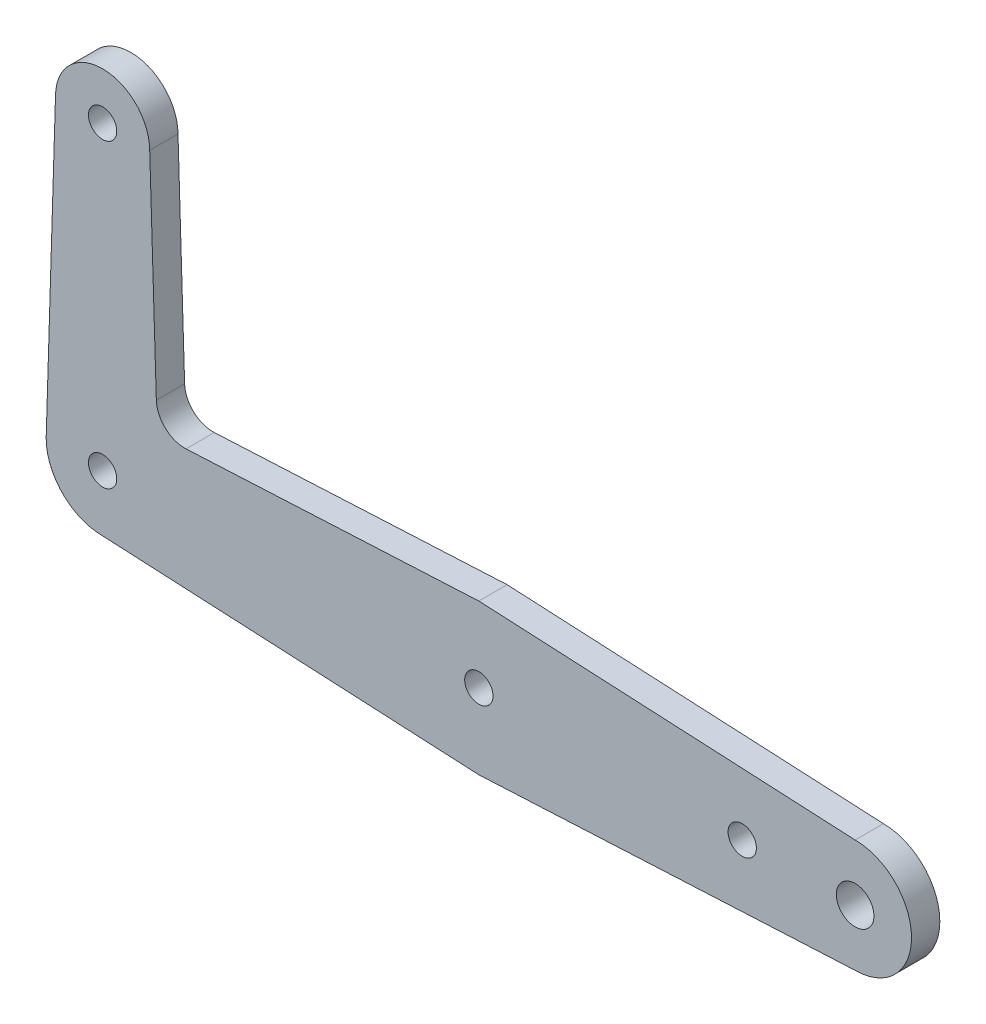
ISO-10303-21;
HEADER;
FILE_DESCRIPTION(('STEP AP214'),'2;1');
FILE_NAME('part.step','',(''),(''),'','','');
FILE_SCHEMA(('AUTOMOTIVE_DESIGN { 1 0 10303 214 1 1 1 1 }'));
ENDSEC;
DATA;
#1=APPLICATION_CONTEXT('core data for automotive mechanical design processes');
#2=APPLICATION_PROTOCOL_DEFINITION('international standard','automotive_design',2000,#1);
#3=PRODUCT_CONTEXT('',#1,'mechanical');
#4=PRODUCT('Part','Part','',(#3));
#5=PRODUCT_RELATED_PRODUCT_CATEGORY('part','',(#4));
#6=PRODUCT_DEFINITION_FORMATION('','',#4);
#7=PRODUCT_DEFINITION_CONTEXT('part definition',#1,'design');
#8=PRODUCT_DEFINITION('design','',#6,#7);
#9=PRODUCT_DEFINITION_SHAPE('','',#8);
#10=(LENGTH_UNIT() NAMED_UNIT(*) SI_UNIT(.MILLI.,.METRE.));
#11=(NAMED_UNIT(*) PLANE_ANGLE_UNIT() SI_UNIT($,.RADIAN.));
#12=(NAMED_UNIT(*) SI_UNIT($,.STERADIAN.) SOLID_ANGLE_UNIT());
#13=UNCERTAINTY_MEASURE_WITH_UNIT(LENGTH_MEASURE(1.E-05),#10,'distance_accuracy_value','');
#14=(GEOMETRIC_REPRESENTATION_CONTEXT(3) GLOBAL_UNCERTAINTY_ASSIGNED_CONTEXT((#13)) GLOBAL_UNIT_ASSIGNED_CONTEXT((#10,
#11,#12)) REPRESENTATION_CONTEXT('',''));
#15=CARTESIAN_POINT('',(0.,0.,0.));
#16=DIRECTION('',(0.,0.,1.));
#17=DIRECTION('',(1.,0.,0.));
#18=AXIS2_PLACEMENT_3D('',#15,#16,#17);
#19=CARTESIAN_POINT('',(3.32543640897757,-66.5087281795511,4.7752));
#20=DIRECTION('',(0.0499376169438924,-0.998752338877845,0.));
#21=DIRECTION('',(0.998752338877845,0.0499376169438924,0.));
#22=AXIS2_PLACEMENT_3D('',#19,#20,#21);
#23=PLANE('',#22);
#24=DIRECTION('',(-0.998752338877845,-0.0499376169438924,0.));
#25=VECTOR('',#24,1.);
#26=CARTESIAN_POINT('',(3.32543640897757,-66.5087281795511,0.));
#27=LINE('',#26,#25);
#28=CARTESIAN_POINT('',(127.,-60.325,0.));
#29=VERTEX_POINT('',#28);
#30=CARTESIAN_POINT('',(63.5,-63.5,0.));
#31=VERTEX_POINT('',#30);
#32=EDGE_CURVE('E196',#29,#31,#27,.T.);
#33=ORIENTED_EDGE('',*,*,#32,.F.);
#34=DIRECTION('',(0.,0.,-1.));
#35=VECTOR('',#34,1.);
#36=CARTESIAN_POINT('',(127.,-60.325,4.7752));
#37=LINE('',#36,#35);
#38=CARTESIAN_POINT('',(127.,-60.325,4.7752));
#39=VERTEX_POINT('',#38);
#40=EDGE_CURVE('E253',#39,#29,#37,.T.);
#41=ORIENTED_EDGE('',*,*,#40,.F.);
#42=DIRECTION('',(-0.998752338877845,-0.0499376169438924,0.));
#43=VECTOR('',#42,1.);
#44=CARTESIAN_POINT('',(3.32543640897757,-66.5087281795511,4.7752));
#45=LINE('',#44,#43);
#46=CARTESIAN_POINT('',(63.5,-63.5,4.7752));
#47=VERTEX_POINT('',#46);
#48=EDGE_CURVE('E153',#39,#47,#45,.T.);
#49=ORIENTED_EDGE('',*,*,#48,.T.);
#50=DIRECTION('',(0.,0.,-1.));
#51=VECTOR('',#50,1.);
#52=CARTESIAN_POINT('',(63.5,-63.5,4.7752));
#53=LINE('',#52,#51);
#54=EDGE_CURVE('E141',#47,#31,#53,.T.);
#55=ORIENTED_EDGE('',*,*,#54,.T.);
#56=EDGE_LOOP('',(#33,#41,#49,#55));
#57=FACE_BOUND('',#56,.T.);
#58=ADVANCED_FACE('F41',(#57),#23,.T.);
#59=CARTESIAN_POINT('',(127.,-50.8,4.7752));
#60=DIRECTION('',(0.,0.,-1.));
#61=DIRECTION('',(-1.,0.,0.));
#62=AXIS2_PLACEMENT_3D('',#59,#60,#61);
#63=CYLINDRICAL_SURFACE('',#62,9.52499999999999);
#64=CARTESIAN_POINT('',(127.,-50.8,0.));
#65=DIRECTION('',(0.,0.,1.));
#66=DIRECTION('',(1.,0.,0.));
#67=AXIS2_PLACEMENT_3D('',#64,#65,#66);
#68=CIRCLE('',#67,9.52499999999999);
#69=CARTESIAN_POINT('',(127.,-41.275,0.));
#70=VERTEX_POINT('',#69);
#71=EDGE_CURVE('E200',#29,#70,#68,.T.);
#72=ORIENTED_EDGE('',*,*,#71,.T.);
#73=DIRECTION('',(0.,0.,-1.));
#74=VECTOR('',#73,1.);
#75=CARTESIAN_POINT('',(127.,-41.275,4.7752));
#76=LINE('',#75,#74);
#77=CARTESIAN_POINT('',(127.,-41.275,4.7752));
#78=VERTEX_POINT('',#77);
#79=EDGE_CURVE('E249',#78,#70,#76,.T.);
#80=ORIENTED_EDGE('',*,*,#79,.F.);
#81=CARTESIAN_POINT('',(127.,-50.8,4.7752));
#82=DIRECTION('',(0.,0.,1.));
#83=DIRECTION('',(1.,0.,0.));
#84=AXIS2_PLACEMENT_3D('',#81,#82,#83);
#85=CIRCLE('',#84,9.52499999999999);
#86=EDGE_CURVE('E157',#39,#78,#85,.T.);
#87=ORIENTED_EDGE('',*,*,#86,.F.);
#88=ORIENTED_EDGE('',*,*,#40,.T.);
#89=EDGE_LOOP('',(#72,#80,#87,#88));
#90=FACE_BOUND('',#89,.T.);
#91=ADVANCED_FACE('F290',(#90),#63,.T.);
#92=CARTESIAN_POINT('',(-1.74189526184539,-34.8379052369077,4.7752));
#93=DIRECTION('',(-0.0499376169438924,-0.998752338877845,0.));
#94=DIRECTION('',(0.998752338877845,-0.0499376169438924,0.));
#95=AXIS2_PLACEMENT_3D('',#92,#93,#94);
#96=PLANE('',#95);
#97=DIRECTION('',(-0.998752338877845,0.0499376169438924,0.));
#98=VECTOR('',#97,1.);
#99=CARTESIAN_POINT('',(-1.74189526184539,-34.8379052369077,0.));
#100=LINE('',#99,#98);
#101=CARTESIAN_POINT('',(63.5,-38.1,0.));
#102=VERTEX_POINT('',#101);
#103=EDGE_CURVE('E204',#70,#102,#100,.T.);
#104=ORIENTED_EDGE('',*,*,#103,.T.);
#105=DIRECTION('',(0.,0.,-1.));
#106=VECTOR('',#105,1.);
#107=CARTESIAN_POINT('',(63.5,-38.1,4.7752));
#108=LINE('',#107,#106);
#109=CARTESIAN_POINT('',(63.5,-38.1,4.7752));
#110=VERTEX_POINT('',#109);
#111=EDGE_CURVE('E245',#110,#102,#108,.T.);
#112=ORIENTED_EDGE('',*,*,#111,.F.);
#113=DIRECTION('',(-0.998752338877845,0.0499376169438924,0.));
#114=VECTOR('',#113,1.);
#115=CARTESIAN_POINT('',(-1.74189526184539,-34.8379052369077,4.7752));
#116=LINE('',#115,#114);
#117=EDGE_CURVE('E164',#78,#110,#116,.T.);
#118=ORIENTED_EDGE('',*,*,#117,.F.);
#119=ORIENTED_EDGE('',*,*,#79,.T.);
#120=EDGE_LOOP('',(#104,#112,#118,#119));
#121=FACE_BOUND('',#120,.T.);
#122=ADVANCED_FACE('F296',(#121),#96,.F.);
#123=CARTESIAN_POINT('',(2.05860349127183,-41.1720698254364,4.7752));
#124=DIRECTION('',(0.0499376169438924,-0.998752338877845,0.));
#125=DIRECTION('',(0.998752338877845,0.0499376169438924,0.));
#126=AXIS2_PLACEMENT_3D('',#123,#124,#125);
#127=PLANE('',#126);
#128=DIRECTION('',(-0.998752338877845,-0.0499376169438924,0.));
#129=VECTOR('',#128,1.);
#130=CARTESIAN_POINT('',(2.05860349127183,-41.1720698254364,0.));
#131=LINE('',#130,#129);
#132=CARTESIAN_POINT('',(14.0760167079213,-40.5711991646039,0.));
#133=VERTEX_POINT('',#132);
#134=EDGE_CURVE('E208',#102,#133,#131,.T.);
#135=ORIENTED_EDGE('',*,*,#134,.T.);
#136=DIRECTION('',(0.,0.,-1.));
#137=VECTOR('',#136,1.);
#138=CARTESIAN_POINT('',(14.0760167079213,-40.5711991646039,4.7752));
#139=LINE('',#138,#137);
#140=CARTESIAN_POINT('',(14.0760167079213,-40.5711991646039,4.7752));
#141=VERTEX_POINT('',#140);
#142=EDGE_CURVE('E57',#133,#141,#139,.F.);
#143=ORIENTED_EDGE('',*,*,#142,.T.);
#144=DIRECTION('',(-0.998752338877845,-0.0499376169438924,0.));
#145=VECTOR('',#144,1.);
#146=CARTESIAN_POINT('',(2.05860349127183,-41.1720698254364,4.7752));
#147=LINE('',#146,#145);
#148=EDGE_CURVE('E168',#110,#141,#147,.T.);
#149=ORIENTED_EDGE('',*,*,#148,.F.);
#150=ORIENTED_EDGE('',*,*,#111,.T.);
#151=EDGE_LOOP('',(#135,#143,#149,#150));
#152=FACE_BOUND('',#151,.T.);
#153=ADVANCED_FACE('F323',(#152),#127,.F.);
#154=CARTESIAN_POINT('',(7.9425671929276,0.246219582980756,4.7752));
#155=DIRECTION('',(0.999519846043263,0.0309851152273412,0.));
#156=DIRECTION('',(-0.0309851152273412,0.999519846043263,0.));
#157=AXIS2_PLACEMENT_3D('',#154,#155,#156);
#158=PLANE('',#157);
#159=DIRECTION('',(0.0309851152273412,-0.999519846043263,0.));
#160=VECTOR('',#159,1.);
#161=CARTESIAN_POINT('',(7.9425671929276,0.246219582980756,4.7752));
#162=LINE('',#161,#160);
#163=CARTESIAN_POINT('',(7.9502,0.,4.7752));
#164=VERTEX_POINT('',#163);
#165=CARTESIAN_POINT('',(9.06464743066507,-35.9499171182281,4.7752));
#166=VERTEX_POINT('',#165);
#167=EDGE_CURVE('E171',#164,#166,#162,.T.);
#168=ORIENTED_EDGE('',*,*,#167,.T.);
#169=DIRECTION('',(0.,0.,-1.));
#170=VECTOR('',#169,1.);
#171=CARTESIAN_POINT('',(9.06464743066507,-35.9499171182281,4.7752));
#172=LINE('',#171,#170);
#173=CARTESIAN_POINT('',(9.06464743066507,-35.9499171182281,0.));
#174=VERTEX_POINT('',#173);
#175=EDGE_CURVE('E256',#166,#174,#172,.T.);
#176=ORIENTED_EDGE('',*,*,#175,.T.);
#177=DIRECTION('',(0.0309851152273412,-0.999519846043263,0.));
#178=VECTOR('',#177,1.);
#179=CARTESIAN_POINT('',(7.9425671929276,0.246219582980756,0.));
#180=LINE('',#179,#178);
#181=CARTESIAN_POINT('',(7.9502,0.,0.));
#182=VERTEX_POINT('',#181);
#183=EDGE_CURVE('E211',#182,#174,#180,.T.);
#184=ORIENTED_EDGE('',*,*,#183,.F.);
#185=DIRECTION('',(0.,0.,-1.));
#186=VECTOR('',#185,1.);
#187=CARTESIAN_POINT('',(7.9502,0.,4.7752));
#188=LINE('',#187,#186);
#189=EDGE_CURVE('E242',#164,#182,#188,.T.);
#190=ORIENTED_EDGE('',*,*,#189,.F.);
#191=EDGE_LOOP('',(#168,#176,#184,#190));
#192=FACE_BOUND('',#191,.T.);
#193=ADVANCED_FACE('F267',(#192),#158,.T.);
#194=CARTESIAN_POINT('',(0.,0.,4.7752));
#195=DIRECTION('',(0.,0.,-1.));
#196=DIRECTION('',(-1.,0.,0.));
#197=AXIS2_PLACEMENT_3D('',#194,#195,#196);
#198=CYLINDRICAL_SURFACE('',#197,7.9502);
#199=CARTESIAN_POINT('',(0.,0.,0.));
#200=DIRECTION('',(0.,0.,1.));
#201=DIRECTION('',(1.,0.,0.));
#202=AXIS2_PLACEMENT_3D('',#199,#200,#201);
#203=CIRCLE('',#202,7.9502);
#204=CARTESIAN_POINT('',(-7.9502,0.,0.));
#205=VERTEX_POINT('',#204);
#206=EDGE_CURVE('E214',#182,#205,#203,.T.);
#207=ORIENTED_EDGE('',*,*,#206,.T.);
#208=DIRECTION('',(0.,0.,-1.));
#209=VECTOR('',#208,1.);
#210=CARTESIAN_POINT('',(-7.9502,0.,4.7752));
#211=LINE('',#210,#209);
#212=CARTESIAN_POINT('',(-7.9502,0.,4.7752));
#213=VERTEX_POINT('',#212);
#214=EDGE_CURVE('E238',#213,#205,#211,.T.);
#215=ORIENTED_EDGE('',*,*,#214,.F.);
#216=CARTESIAN_POINT('',(0.,0.,4.7752));
#217=DIRECTION('',(0.,0.,1.));
#218=DIRECTION('',(1.,0.,0.));
#219=AXIS2_PLACEMENT_3D('',#216,#217,#218);
#220=CIRCLE('',#219,7.9502);
#221=EDGE_CURVE('E175',#164,#213,#220,.T.);
#222=ORIENTED_EDGE('',*,*,#221,.F.);
#223=ORIENTED_EDGE('',*,*,#189,.T.);
#224=EDGE_LOOP('',(#207,#215,#222,#223));
#225=FACE_BOUND('',#224,.T.);
#226=ADVANCED_FACE('F275',(#225),#198,.T.);
#227=CARTESIAN_POINT('',(-7.9425671929276,0.246219582980755,4.7752));
#228=DIRECTION('',(0.999519846043263,-0.0309851152273411,0.));
#229=DIRECTION('',(0.0309851152273411,0.999519846043263,0.));
#230=AXIS2_PLACEMENT_3D('',#227,#228,#229);
#231=PLANE('',#230);
#232=DIRECTION('',(-0.0309851152273411,-0.999519846043263,0.));
#233=VECTOR('',#232,1.);
#234=CARTESIAN_POINT('',(-7.9425671929276,0.246219582980755,0.));
#235=LINE('',#234,#233);
#236=CARTESIAN_POINT('',(-9.525,-50.8,0.));
#237=VERTEX_POINT('',#236);
#238=EDGE_CURVE('E218',#205,#237,#235,.T.);
#239=ORIENTED_EDGE('',*,*,#238,.T.);
#240=DIRECTION('',(0.,0.,-1.));
#241=VECTOR('',#240,1.);
#242=CARTESIAN_POINT('',(-9.525,-50.8,4.7752));
#243=LINE('',#242,#241);
#244=CARTESIAN_POINT('',(-9.525,-50.8,4.7752));
#245=VERTEX_POINT('',#244);
#246=EDGE_CURVE('E234',#245,#237,#243,.T.);
#247=ORIENTED_EDGE('',*,*,#246,.F.);
#248=DIRECTION('',(-0.0309851152273411,-0.999519846043263,0.));
#249=VECTOR('',#248,1.);
#250=CARTESIAN_POINT('',(-7.9425671929276,0.246219582980755,4.7752));
#251=LINE('',#250,#249);
#252=EDGE_CURVE('E179',#213,#245,#251,.T.);
#253=ORIENTED_EDGE('',*,*,#252,.F.);
#254=ORIENTED_EDGE('',*,*,#214,.T.);
#255=EDGE_LOOP('',(#239,#247,#253,#254));
#256=FACE_BOUND('',#255,.T.);
#257=ADVANCED_FACE('F309',(#256),#231,.F.);
#258=CARTESIAN_POINT('',(0.,-50.8,4.7752));
#259=DIRECTION('',(0.,0.,-1.));
#260=DIRECTION('',(-1.,0.,0.));
#261=AXIS2_PLACEMENT_3D('',#258,#259,#260);
#262=CYLINDRICAL_SURFACE('',#261,9.525);
#263=CARTESIAN_POINT('',(0.,-50.8,0.));
#264=DIRECTION('',(0.,0.,1.));
#265=DIRECTION('',(1.,0.,0.));
#266=AXIS2_PLACEMENT_3D('',#263,#264,#265);
#267=CIRCLE('',#266,9.525);
#268=CARTESIAN_POINT('',(0.,-60.325,0.));
#269=VERTEX_POINT('',#268);
#270=EDGE_CURVE('E222',#237,#269,#267,.T.);
#271=ORIENTED_EDGE('',*,*,#270,.T.);
#272=DIRECTION('',(0.,0.,-1.));
#273=VECTOR('',#272,1.);
#274=CARTESIAN_POINT('',(0.,-60.325,4.7752));
#275=LINE('',#274,#273);
#276=CARTESIAN_POINT('',(0.,-60.325,4.7752));
#277=VERTEX_POINT('',#276);
#278=EDGE_CURVE('E231',#277,#269,#275,.T.);
#279=ORIENTED_EDGE('',*,*,#278,.F.);
#280=CARTESIAN_POINT('',(0.,-50.8,4.7752));
#281=DIRECTION('',(0.,0.,1.));
#282=DIRECTION('',(1.,0.,0.));
#283=AXIS2_PLACEMENT_3D('',#280,#281,#282);
#284=CIRCLE('',#283,9.525);
#285=EDGE_CURVE('E183',#245,#277,#284,.T.);
#286=ORIENTED_EDGE('',*,*,#285,.F.);
#287=ORIENTED_EDGE('',*,*,#246,.T.);
#288=EDGE_LOOP('',(#271,#279,#286,#287));
#289=FACE_BOUND('',#288,.T.);
#290=ADVANCED_FACE('F305',(#289),#262,.T.);
#291=CARTESIAN_POINT('',(0.,-50.8,4.7752));
#292=DIRECTION('',(0.,0.,-1.));
#293=DIRECTION('',(-1.,0.,0.));
#294=AXIS2_PLACEMENT_3D('',#291,#292,#293);
#295=CYLINDRICAL_SURFACE('',#294,9.525);
#296=CARTESIAN_POINT('',(0.,-50.8,0.));
#297=DIRECTION('',(0.,0.,1.));
#298=DIRECTION('',(1.,0.,0.));
#299=AXIS2_PLACEMENT_3D('',#296,#297,#298);
#300=CIRCLE('',#299,9.525);
#301=CARTESIAN_POINT('',(9.525,-50.8,0.));
#302=VERTEX_POINT('',#301);
#303=CARTESIAN_POINT('',(9.50671052618434,-50.2100169736883,0.));
#304=VERTEX_POINT('',#303);
#305=EDGE_CURVE('E135',#302,#304,#300,.T.);
#306=ORIENTED_EDGE('',*,*,#305,.F.);
#307=DIRECTION('',(0.,0.,-1.));
#308=VECTOR('',#307,1.);
#309=CARTESIAN_POINT('',(9.525,-50.8,4.7752));
#310=LINE('',#309,#308);
#311=CARTESIAN_POINT('',(9.525,-50.8,4.7752));
#312=VERTEX_POINT('',#311);
#313=EDGE_CURVE('E129',#312,#302,#310,.T.);
#314=ORIENTED_EDGE('',*,*,#313,.F.);
#315=CARTESIAN_POINT('',(0.,-50.8,4.7752));
#316=DIRECTION('',(0.,0.,1.));
#317=DIRECTION('',(1.,0.,0.));
#318=AXIS2_PLACEMENT_3D('',#315,#316,#317);
#319=CIRCLE('',#318,9.525);
#320=CARTESIAN_POINT('',(9.50671052618434,-50.2100169736883,4.7752));
#321=VERTEX_POINT('',#320);
#322=EDGE_CURVE('E132',#312,#321,#319,.T.);
#323=ORIENTED_EDGE('',*,*,#322,.T.);
#324=DIRECTION('',(0.,0.,-1.));
#325=VECTOR('',#324,1.);
#326=CARTESIAN_POINT('',(9.50671052618434,-50.2100169736883,4.7752));
#327=LINE('',#326,#325);
#328=EDGE_CURVE('E142',#321,#304,#327,.T.);
#329=ORIENTED_EDGE('',*,*,#328,.T.);
#330=EDGE_LOOP('',(#306,#314,#323,#329));
#331=FACE_BOUND('',#330,.T.);
#332=ADVANCED_FACE('F131',(#331),#295,.F.);
#333=CARTESIAN_POINT('',(7.94256719292769,0.246219582980743,4.7752));
#334=DIRECTION('',(0.999519846043263,0.0309851152273392,0.));
#335=DIRECTION('',(-0.0309851152273392,0.999519846043263,0.));
#336=AXIS2_PLACEMENT_3D('',#333,#334,#335);
#337=PLANE('',#336);
#338=DIRECTION('',(0.0309851152273392,-0.999519846043263,0.));
#339=VECTOR('',#338,1.);
#340=CARTESIAN_POINT('',(7.94256719292769,0.246219582980743,0.));
#341=LINE('',#340,#339);
#342=EDGE_CURVE('E192',#304,#302,#341,.T.);
#343=ORIENTED_EDGE('',*,*,#342,.F.);
#344=ORIENTED_EDGE('',*,*,#328,.F.);
#345=DIRECTION('',(0.0309851152273392,-0.999519846043263,0.));
#346=VECTOR('',#345,1.);
#347=CARTESIAN_POINT('',(7.94256719292769,0.246219582980743,4.7752));
#348=LINE('',#347,#346);
#349=EDGE_CURVE('E147',#321,#312,#348,.T.);
#350=ORIENTED_EDGE('',*,*,#349,.T.);
#351=ORIENTED_EDGE('',*,*,#313,.T.);
#352=EDGE_LOOP('',(#343,#344,#350,#351));
#353=FACE_BOUND('',#352,.T.);
#354=ADVANCED_FACE('F151',(#353),#337,.T.);
#355=CARTESIAN_POINT('',(-3.00872817955113,-60.1745635910224,4.7752));
#356=DIRECTION('',(-0.0499376169438923,-0.998752338877845,0.));
#357=DIRECTION('',(0.998752338877845,-0.0499376169438923,0.));
#358=AXIS2_PLACEMENT_3D('',#355,#356,#357);
#359=PLANE('',#358);
#360=DIRECTION('',(-0.998752338877845,0.0499376169438923,0.));
#361=VECTOR('',#360,1.);
#362=CARTESIAN_POINT('',(-3.00872817955113,-60.1745635910224,0.));
#363=LINE('',#362,#361);
#364=EDGE_CURVE('E149',#31,#269,#363,.T.);
#365=ORIENTED_EDGE('',*,*,#364,.F.);
#366=ORIENTED_EDGE('',*,*,#54,.F.);
#367=DIRECTION('',(-0.998752338877845,0.0499376169438923,0.));
#368=VECTOR('',#367,1.);
#369=CARTESIAN_POINT('',(-3.00872817955113,-60.1745635910224,4.7752));
#370=LINE('',#369,#368);
#371=EDGE_CURVE('E186',#47,#277,#370,.T.);
#372=ORIENTED_EDGE('',*,*,#371,.T.);
#373=ORIENTED_EDGE('',*,*,#278,.T.);
#374=EDGE_LOOP('',(#365,#366,#372,#373));
#375=FACE_BOUND('',#374,.T.);
#376=ADVANCED_FACE('F303',(#375),#359,.T.);
#377=CARTESIAN_POINT('',(0.,0.,4.7752));
#378=DIRECTION('',(0.,0.,1.));
#379=DIRECTION('',(1.,0.,0.));
#380=AXIS2_PLACEMENT_3D('',#377,#378,#379);
#381=PLANE('',#380);
#382=CARTESIAN_POINT('',(127.,-50.8,4.7752));
#383=DIRECTION('',(0.,0.,1.));
#384=DIRECTION('',(1.,0.,0.));
#385=AXIS2_PLACEMENT_3D('',#382,#383,#384);
#386=CIRCLE('',#385,3.175);
#387=CARTESIAN_POINT('',(130.175,-50.8,4.7752));
#388=VERTEX_POINT('',#387);
#389=EDGE_CURVE('E370',#388,#388,#386,.T.);
#390=ORIENTED_EDGE('',*,*,#389,.F.);
#391=EDGE_LOOP('',(#390));
#392=FACE_BOUND('',#391,.T.);
#393=CARTESIAN_POINT('',(0.,0.,4.7752));
#394=DIRECTION('',(0.,0.,1.));
#395=DIRECTION('',(1.,0.,0.));
#396=AXIS2_PLACEMENT_3D('',#393,#394,#395);
#397=CIRCLE('',#396,2.3876);
#398=CARTESIAN_POINT('',(2.3876,0.,4.7752));
#399=VERTEX_POINT('',#398);
#400=EDGE_CURVE('E380',#399,#399,#397,.T.);
#401=ORIENTED_EDGE('',*,*,#400,.F.);
#402=EDGE_LOOP('',(#401));
#403=FACE_BOUND('',#402,.T.);
#404=CARTESIAN_POINT('',(0.,-50.8,4.7752));
#405=DIRECTION('',(0.,0.,1.));
#406=DIRECTION('',(1.,0.,0.));
#407=AXIS2_PLACEMENT_3D('',#404,#405,#406);
#408=CIRCLE('',#407,2.3876);
#409=CARTESIAN_POINT('',(2.3876,-50.8,4.7752));
#410=VERTEX_POINT('',#409);
#411=EDGE_CURVE('E388',#410,#410,#408,.T.);
#412=ORIENTED_EDGE('',*,*,#411,.F.);
#413=EDGE_LOOP('',(#412));
#414=FACE_BOUND('',#413,.T.);
#415=CARTESIAN_POINT('',(63.5,-50.8,4.7752));
#416=DIRECTION('',(0.,0.,1.));
#417=DIRECTION('',(1.,0.,0.));
#418=AXIS2_PLACEMENT_3D('',#415,#416,#417);
#419=CIRCLE('',#418,2.3876);
#420=CARTESIAN_POINT('',(65.8876,-50.8,4.7752));
#421=VERTEX_POINT('',#420);
#422=EDGE_CURVE('E396',#421,#421,#419,.T.);
#423=ORIENTED_EDGE('',*,*,#422,.F.);
#424=EDGE_LOOP('',(#423));
#425=FACE_BOUND('',#424,.T.);
#426=CARTESIAN_POINT('',(107.95,-50.8,4.7752));
#427=DIRECTION('',(0.,0.,1.));
#428=DIRECTION('',(1.,0.,0.));
#429=AXIS2_PLACEMENT_3D('',#426,#427,#428);
#430=CIRCLE('',#429,2.3876);
#431=CARTESIAN_POINT('',(110.3376,-50.8,4.7752));
#432=VERTEX_POINT('',#431);
#433=EDGE_CURVE('E374',#432,#432,#430,.T.);
#434=ORIENTED_EDGE('',*,*,#433,.F.);
#435=EDGE_LOOP('',(#434));
#436=FACE_BOUND('',#435,.T.);
#437=ORIENTED_EDGE('',*,*,#322,.F.);
#438=ORIENTED_EDGE('',*,*,#349,.F.);
#439=EDGE_LOOP('',(#437,#438));
#440=FACE_BOUND('',#439,.T.);
#441=ORIENTED_EDGE('',*,*,#48,.F.);
#442=ORIENTED_EDGE('',*,*,#86,.T.);
#443=ORIENTED_EDGE('',*,*,#117,.T.);
#444=ORIENTED_EDGE('',*,*,#148,.T.);
#445=CARTESIAN_POINT('',(13.8375545994909,-35.8019569959945,4.7752));
#446=DIRECTION('',(0.,0.,1.));
#447=DIRECTION('',(1.,0.,0.));
#448=AXIS2_PLACEMENT_3D('',#445,#446,#447);
#449=CIRCLE('',#448,4.7752);
#450=EDGE_CURVE('E11',#141,#166,#449,.F.);
#451=ORIENTED_EDGE('',*,*,#450,.T.);
#452=ORIENTED_EDGE('',*,*,#167,.F.);
#453=ORIENTED_EDGE('',*,*,#221,.T.);
#454=ORIENTED_EDGE('',*,*,#252,.T.);
#455=ORIENTED_EDGE('',*,*,#285,.T.);
#456=ORIENTED_EDGE('',*,*,#371,.F.);
#457=EDGE_LOOP('',(#441,#442,#443,#444,#451,#452,#453,#454,#455,#456));
#458=FACE_BOUND('',#457,.T.);
#459=ADVANCED_FACE('F145',(#392,#403,#414,#425,#436,#440,#458),#381,.T.);
#460=CARTESIAN_POINT('',(0.,0.,0.));
#461=DIRECTION('',(0.,0.,1.));
#462=DIRECTION('',(1.,0.,0.));
#463=AXIS2_PLACEMENT_3D('',#460,#461,#462);
#464=PLANE('',#463);
#465=CARTESIAN_POINT('',(127.,-50.8,0.));
#466=DIRECTION('',(0.,0.,1.));
#467=DIRECTION('',(1.,0.,0.));
#468=AXIS2_PLACEMENT_3D('',#465,#466,#467);
#469=CIRCLE('',#468,3.175);
#470=CARTESIAN_POINT('',(130.175,-50.8,0.));
#471=VERTEX_POINT('',#470);
#472=EDGE_CURVE('E368',#471,#471,#469,.T.);
#473=ORIENTED_EDGE('',*,*,#472,.T.);
#474=EDGE_LOOP('',(#473));
#475=FACE_BOUND('',#474,.T.);
#476=CARTESIAN_POINT('',(0.,0.,0.));
#477=DIRECTION('',(0.,0.,1.));
#478=DIRECTION('',(1.,0.,0.));
#479=AXIS2_PLACEMENT_3D('',#476,#477,#478);
#480=CIRCLE('',#479,2.3876);
#481=CARTESIAN_POINT('',(2.3876,0.,0.));
#482=VERTEX_POINT('',#481);
#483=EDGE_CURVE('E193',#482,#482,#480,.T.);
#484=ORIENTED_EDGE('',*,*,#483,.T.);
#485=EDGE_LOOP('',(#484));
#486=FACE_BOUND('',#485,.T.);
#487=CARTESIAN_POINT('',(0.,-50.8,0.));
#488=DIRECTION('',(0.,0.,1.));
#489=DIRECTION('',(1.,0.,0.));
#490=AXIS2_PLACEMENT_3D('',#487,#488,#489);
#491=CIRCLE('',#490,2.3876);
#492=CARTESIAN_POINT('',(2.3876,-50.8,0.));
#493=VERTEX_POINT('',#492);
#494=EDGE_CURVE('E384',#493,#493,#491,.T.);
#495=ORIENTED_EDGE('',*,*,#494,.T.);
#496=EDGE_LOOP('',(#495));
#497=FACE_BOUND('',#496,.T.);
#498=CARTESIAN_POINT('',(63.5,-50.8,0.));
#499=DIRECTION('',(0.,0.,1.));
#500=DIRECTION('',(1.,0.,0.));
#501=AXIS2_PLACEMENT_3D('',#498,#499,#500);
#502=CIRCLE('',#501,2.3876);
#503=CARTESIAN_POINT('',(65.8876,-50.8,0.));
#504=VERTEX_POINT('',#503);
#505=EDGE_CURVE('E392',#504,#504,#502,.T.);
#506=ORIENTED_EDGE('',*,*,#505,.T.);
#507=EDGE_LOOP('',(#506));
#508=FACE_BOUND('',#507,.T.);
#509=CARTESIAN_POINT('',(107.95,-50.8,0.));
#510=DIRECTION('',(0.,0.,1.));
#511=DIRECTION('',(1.,0.,0.));
#512=AXIS2_PLACEMENT_3D('',#509,#510,#511);
#513=CIRCLE('',#512,2.3876);
#514=CARTESIAN_POINT('',(110.3376,-50.8,0.));
#515=VERTEX_POINT('',#514);
#516=EDGE_CURVE('E400',#515,#515,#513,.T.);
#517=ORIENTED_EDGE('',*,*,#516,.T.);
#518=EDGE_LOOP('',(#517));
#519=FACE_BOUND('',#518,.T.);
#520=ORIENTED_EDGE('',*,*,#305,.T.);
#521=ORIENTED_EDGE('',*,*,#342,.T.);
#522=EDGE_LOOP('',(#520,#521));
#523=FACE_BOUND('',#522,.T.);
#524=ORIENTED_EDGE('',*,*,#32,.T.);
#525=ORIENTED_EDGE('',*,*,#364,.T.);
#526=ORIENTED_EDGE('',*,*,#270,.F.);
#527=ORIENTED_EDGE('',*,*,#238,.F.);
#528=ORIENTED_EDGE('',*,*,#206,.F.);
#529=ORIENTED_EDGE('',*,*,#183,.T.);
#530=CARTESIAN_POINT('',(13.8375545994909,-35.8019569959945,0.));
#531=DIRECTION('',(0.,0.,1.));
#532=DIRECTION('',(1.,0.,0.));
#533=AXIS2_PLACEMENT_3D('',#530,#531,#532);
#534=CIRCLE('',#533,4.7752);
#535=EDGE_CURVE('E50',#174,#133,#534,.T.);
#536=ORIENTED_EDGE('',*,*,#535,.T.);
#537=ORIENTED_EDGE('',*,*,#134,.F.);
#538=ORIENTED_EDGE('',*,*,#103,.F.);
#539=ORIENTED_EDGE('',*,*,#71,.F.);
#540=EDGE_LOOP('',(#524,#525,#526,#527,#528,#529,#536,#537,#538,#539));
#541=FACE_BOUND('',#540,.T.);
#542=ADVANCED_FACE('F272',(#475,#486,#497,#508,#519,#523,#541),#464,.F.);
#543=CARTESIAN_POINT('',(13.8375545994909,-35.8019569959945,4.7752));
#544=DIRECTION('',(0.,0.,-1.));
#545=DIRECTION('',(-1.,0.,0.));
#546=AXIS2_PLACEMENT_3D('',#543,#544,#545);
#547=CYLINDRICAL_SURFACE('',#546,4.7752);
#548=ORIENTED_EDGE('',*,*,#450,.F.);
#549=ORIENTED_EDGE('',*,*,#142,.F.);
#550=ORIENTED_EDGE('',*,*,#535,.F.);
#551=ORIENTED_EDGE('',*,*,#175,.F.);
#552=EDGE_LOOP('',(#548,#549,#550,#551));
#553=FACE_BOUND('',#552,.T.);
#554=ADVANCED_FACE('F43',(#553),#547,.F.);
#555=CARTESIAN_POINT('',(107.95,-50.8,0.));
#556=DIRECTION('',(0.,0.,1.));
#557=DIRECTION('',(1.,0.,0.));
#558=AXIS2_PLACEMENT_3D('',#555,#556,#557);
#559=CYLINDRICAL_SURFACE('',#558,2.3876);
#560=ORIENTED_EDGE('',*,*,#516,.F.);
#561=EDGE_LOOP('',(#560));
#562=FACE_BOUND('',#561,.T.);
#563=ORIENTED_EDGE('',*,*,#433,.T.);
#564=EDGE_LOOP('',(#563));
#565=FACE_BOUND('',#564,.T.);
#566=ADVANCED_FACE('F279',(#562,#565),#559,.F.);
#567=CARTESIAN_POINT('',(63.5,-50.8,0.));
#568=DIRECTION('',(0.,0.,1.));
#569=DIRECTION('',(1.,0.,0.));
#570=AXIS2_PLACEMENT_3D('',#567,#568,#569);
#571=CYLINDRICAL_SURFACE('',#570,2.3876);
#572=ORIENTED_EDGE('',*,*,#505,.F.);
#573=EDGE_LOOP('',(#572));
#574=FACE_BOUND('',#573,.T.);
#575=ORIENTED_EDGE('',*,*,#422,.T.);
#576=EDGE_LOOP('',(#575));
#577=FACE_BOUND('',#576,.T.);
#578=ADVANCED_FACE('F284',(#574,#577),#571,.F.);
#579=CARTESIAN_POINT('',(0.,-50.8,0.));
#580=DIRECTION('',(0.,0.,1.));
#581=DIRECTION('',(1.,0.,0.));
#582=AXIS2_PLACEMENT_3D('',#579,#580,#581);
#583=CYLINDRICAL_SURFACE('',#582,2.3876);
#584=ORIENTED_EDGE('',*,*,#494,.F.);
#585=EDGE_LOOP('',(#584));
#586=FACE_BOUND('',#585,.T.);
#587=ORIENTED_EDGE('',*,*,#411,.T.);
#588=EDGE_LOOP('',(#587));
#589=FACE_BOUND('',#588,.T.);
#590=ADVANCED_FACE('F351',(#586,#589),#583,.F.);
#591=CARTESIAN_POINT('',(0.,0.,0.));
#592=DIRECTION('',(0.,0.,1.));
#593=DIRECTION('',(1.,0.,0.));
#594=AXIS2_PLACEMENT_3D('',#591,#592,#593);
#595=CYLINDRICAL_SURFACE('',#594,2.3876);
#596=ORIENTED_EDGE('',*,*,#483,.F.);
#597=EDGE_LOOP('',(#596));
#598=FACE_BOUND('',#597,.T.);
#599=ORIENTED_EDGE('',*,*,#400,.T.);
#600=EDGE_LOOP('',(#599));
#601=FACE_BOUND('',#600,.T.);
#602=ADVANCED_FACE('F355',(#598,#601),#595,.F.);
#603=CARTESIAN_POINT('',(127.,-50.8,0.));
#604=DIRECTION('',(0.,0.,1.));
#605=DIRECTION('',(1.,0.,0.));
#606=AXIS2_PLACEMENT_3D('',#603,#604,#605);
#607=CYLINDRICAL_SURFACE('',#606,3.175);
#608=ORIENTED_EDGE('',*,*,#472,.F.);
#609=EDGE_LOOP('',(#608));
#610=FACE_BOUND('',#609,.T.);
#611=ORIENTED_EDGE('',*,*,#389,.T.);
#612=EDGE_LOOP('',(#611));
#613=FACE_BOUND('',#612,.T.);
#614=ADVANCED_FACE('F359',(#610,#613),#607,.F.);
#615=CLOSED_SHELL('',(#58,#91,#122,#153,#193,#226,#257,#290,#332,#354,#376,#459,#542,#554,#566,
#578,#590,#602,#614));
#616=MANIFOLD_SOLID_BREP('B2',#615);
#617=ADVANCED_BREP_SHAPE_REPRESENTATION('',(#18,#616),#14);
#618=SHAPE_DEFINITION_REPRESENTATION(#9,#617);
ENDSEC;
END-ISO-10303-21;
